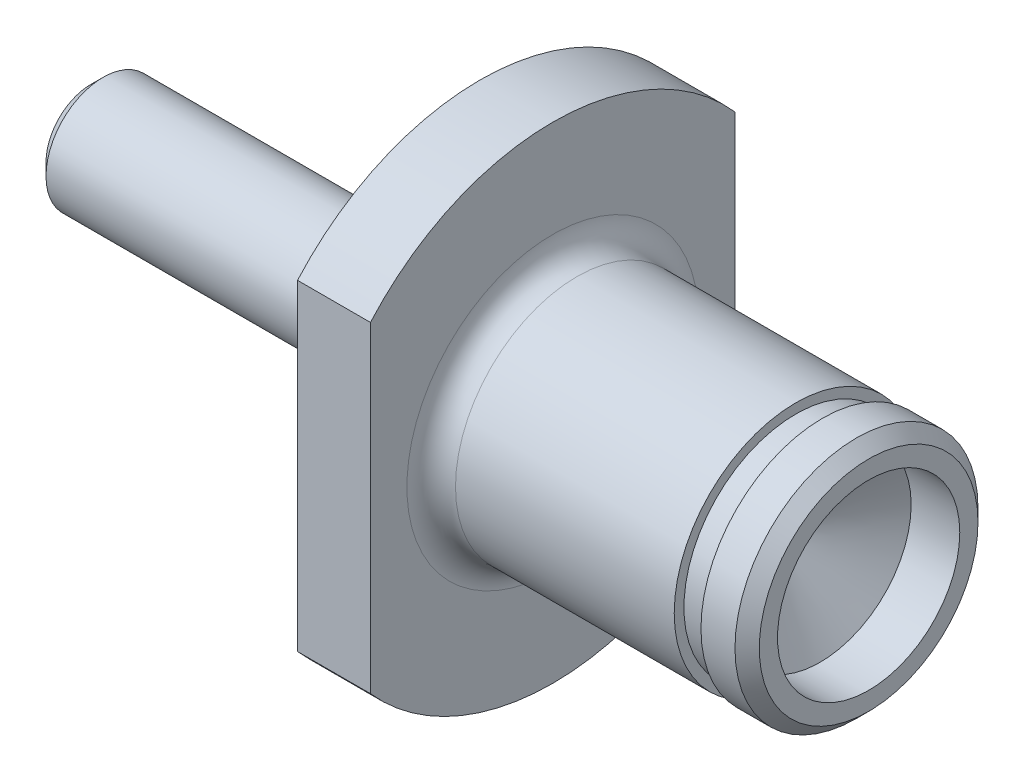
ISO-10303-21;
HEADER;
FILE_DESCRIPTION(('STEP AP214'),'2;1');
FILE_NAME('part.step','',(''),(''),'','','');
FILE_SCHEMA(('AUTOMOTIVE_DESIGN { 1 0 10303 214 1 1 1 1 }'));
ENDSEC;
DATA;
#1=APPLICATION_CONTEXT('core data for automotive mechanical design processes');
#2=APPLICATION_PROTOCOL_DEFINITION('international standard','automotive_design',2000,#1);
#3=PRODUCT_CONTEXT('',#1,'mechanical');
#4=PRODUCT('Part','Part','',(#3));
#5=PRODUCT_RELATED_PRODUCT_CATEGORY('part','',(#4));
#6=PRODUCT_DEFINITION_FORMATION('','',#4);
#7=PRODUCT_DEFINITION_CONTEXT('part definition',#1,'design');
#8=PRODUCT_DEFINITION('design','',#6,#7);
#9=PRODUCT_DEFINITION_SHAPE('','',#8);
#10=(LENGTH_UNIT() NAMED_UNIT(*) SI_UNIT(.MILLI.,.METRE.));
#11=(NAMED_UNIT(*) PLANE_ANGLE_UNIT() SI_UNIT($,.RADIAN.));
#12=(NAMED_UNIT(*) SI_UNIT($,.STERADIAN.) SOLID_ANGLE_UNIT());
#13=UNCERTAINTY_MEASURE_WITH_UNIT(LENGTH_MEASURE(1.E-05),#10,'distance_accuracy_value','');
#14=(GEOMETRIC_REPRESENTATION_CONTEXT(3) GLOBAL_UNCERTAINTY_ASSIGNED_CONTEXT((#13)) GLOBAL_UNIT_ASSIGNED_CONTEXT((#10,
#11,#12)) REPRESENTATION_CONTEXT('',''));
#15=CARTESIAN_POINT('',(0.,0.,0.));
#16=DIRECTION('',(0.,0.,1.));
#17=DIRECTION('',(1.,0.,0.));
#18=AXIS2_PLACEMENT_3D('',#15,#16,#17);
#19=CARTESIAN_POINT('',(16.,2.35,0.));
#20=DIRECTION('',(-1.,0.,0.));
#21=DIRECTION('',(0.,0.,1.));
#22=AXIS2_PLACEMENT_3D('',#19,#20,#21);
#23=PLANE('',#22);
#24=CARTESIAN_POINT('',(16.,0.,0.));
#25=DIRECTION('',(-1.,0.,0.));
#26=DIRECTION('',(0.,0.,1.));
#27=AXIS2_PLACEMENT_3D('',#24,#25,#26);
#28=CIRCLE('',#27,2.85);
#29=CARTESIAN_POINT('',(16.,0.,2.85));
#30=VERTEX_POINT('',#29);
#31=EDGE_CURVE('E206',#30,#30,#28,.F.);
#32=ORIENTED_EDGE('',*,*,#31,.T.);
#33=EDGE_LOOP('',(#32));
#34=FACE_BOUND('',#33,.T.);
#35=CARTESIAN_POINT('',(16.,0.,0.));
#36=DIRECTION('',(1.,0.,0.));
#37=DIRECTION('',(0.,0.,-1.));
#38=AXIS2_PLACEMENT_3D('',#35,#36,#37);
#39=CIRCLE('',#38,10.);
#40=CARTESIAN_POINT('',(16.,6.61437827766148,-7.5));
#41=VERTEX_POINT('',#40);
#42=CARTESIAN_POINT('',(16.,6.61437827766148,7.5));
#43=VERTEX_POINT('',#42);
#44=EDGE_CURVE('E182',#41,#43,#39,.T.);
#45=ORIENTED_EDGE('',*,*,#44,.F.);
#46=DIRECTION('',(0.,1.,0.));
#47=VECTOR('',#46,1.);
#48=CARTESIAN_POINT('',(16.,0.,-7.5));
#49=LINE('',#48,#47);
#50=CARTESIAN_POINT('',(16.,-6.61437827766148,-7.5));
#51=VERTEX_POINT('',#50);
#52=EDGE_CURVE('E167',#51,#41,#49,.T.);
#53=ORIENTED_EDGE('',*,*,#52,.F.);
#54=CARTESIAN_POINT('',(16.,-6.61437827766148,7.5));
#55=VERTEX_POINT('',#54);
#56=EDGE_CURVE('E191',#55,#51,#39,.T.);
#57=ORIENTED_EDGE('',*,*,#56,.F.);
#58=DIRECTION('',(0.,1.,0.));
#59=VECTOR('',#58,1.);
#60=CARTESIAN_POINT('',(16.,0.,7.5));
#61=LINE('',#60,#59);
#62=EDGE_CURVE('E188',#55,#43,#61,.T.);
#63=ORIENTED_EDGE('',*,*,#62,.T.);
#64=EDGE_LOOP('',(#45,#53,#57,#63));
#65=FACE_BOUND('',#64,.T.);
#66=ADVANCED_FACE('F123',(#34,#65),#23,.T.);
#67=CARTESIAN_POINT('',(0.,0.,0.));
#68=DIRECTION('',(1.,0.,0.));
#69=DIRECTION('',(0.,0.,-1.));
#70=AXIS2_PLACEMENT_3D('',#67,#68,#69);
#71=CYLINDRICAL_SURFACE('',#70,10.);
#72=CARTESIAN_POINT('',(19.,0.,0.));
#73=DIRECTION('',(1.,0.,0.));
#74=DIRECTION('',(0.,0.,-1.));
#75=AXIS2_PLACEMENT_3D('',#72,#73,#74);
#76=CIRCLE('',#75,10.);
#77=CARTESIAN_POINT('',(19.,6.61437827766148,-7.5));
#78=VERTEX_POINT('',#77);
#79=CARTESIAN_POINT('',(19.,6.61437827766148,7.5));
#80=VERTEX_POINT('',#79);
#81=EDGE_CURVE('E184',#78,#80,#76,.T.);
#82=ORIENTED_EDGE('',*,*,#81,.F.);
#83=DIRECTION('',(1.,0.,0.));
#84=VECTOR('',#83,1.);
#85=CARTESIAN_POINT('',(2.53708798216373,6.61437827766148,-7.5));
#86=LINE('',#85,#84);
#87=EDGE_CURVE('E148',#41,#78,#86,.T.);
#88=ORIENTED_EDGE('',*,*,#87,.F.);
#89=ORIENTED_EDGE('',*,*,#44,.T.);
#90=DIRECTION('',(1.,0.,0.));
#91=VECTOR('',#90,1.);
#92=CARTESIAN_POINT('',(2.53708798216373,6.61437827766148,7.5));
#93=LINE('',#92,#91);
#94=EDGE_CURVE('E353',#43,#80,#93,.T.);
#95=ORIENTED_EDGE('',*,*,#94,.T.);
#96=EDGE_LOOP('',(#82,#88,#89,#95));
#97=FACE_BOUND('',#96,.T.);
#98=ADVANCED_FACE('F180',(#97),#71,.T.);
#99=ORIENTED_EDGE('',*,*,#56,.T.);
#100=DIRECTION('',(1.,0.,0.));
#101=VECTOR('',#100,1.);
#102=CARTESIAN_POINT('',(2.53708798216373,-6.61437827766148,-7.5));
#103=LINE('',#102,#101);
#104=CARTESIAN_POINT('',(19.,-6.61437827766148,-7.5));
#105=VERTEX_POINT('',#104);
#106=EDGE_CURVE('E170',#51,#105,#103,.T.);
#107=ORIENTED_EDGE('',*,*,#106,.T.);
#108=CARTESIAN_POINT('',(19.,-6.61437827766148,7.5));
#109=VERTEX_POINT('',#108);
#110=EDGE_CURVE('E319',#109,#105,#76,.T.);
#111=ORIENTED_EDGE('',*,*,#110,.F.);
#112=DIRECTION('',(1.,0.,0.));
#113=VECTOR('',#112,1.);
#114=CARTESIAN_POINT('',(2.53708798216373,-6.61437827766148,7.5));
#115=LINE('',#114,#113);
#116=EDGE_CURVE('E140',#55,#109,#115,.T.);
#117=ORIENTED_EDGE('',*,*,#116,.F.);
#118=EDGE_LOOP('',(#99,#107,#111,#117));
#119=FACE_BOUND('',#118,.T.);
#120=ADVANCED_FACE('F246',(#119),#71,.T.);
#121=CARTESIAN_POINT('',(19.,10.,0.));
#122=DIRECTION('',(1.,0.,0.));
#123=DIRECTION('',(0.,0.,-1.));
#124=AXIS2_PLACEMENT_3D('',#121,#122,#123);
#125=PLANE('',#124);
#126=CARTESIAN_POINT('',(19.,0.,0.));
#127=DIRECTION('',(1.,0.,0.));
#128=DIRECTION('',(0.,0.,-1.));
#129=AXIS2_PLACEMENT_3D('',#126,#127,#128);
#130=CIRCLE('',#129,6.);
#131=CARTESIAN_POINT('',(19.,0.,-6.));
#132=VERTEX_POINT('',#131);
#133=EDGE_CURVE('E217',#132,#132,#130,.F.);
#134=ORIENTED_EDGE('',*,*,#133,.T.);
#135=EDGE_LOOP('',(#134));
#136=FACE_BOUND('',#135,.T.);
#137=ORIENTED_EDGE('',*,*,#110,.T.);
#138=DIRECTION('',(0.,1.,0.));
#139=VECTOR('',#138,1.);
#140=CARTESIAN_POINT('',(19.,0.,-7.5));
#141=LINE('',#140,#139);
#142=EDGE_CURVE('E320',#105,#78,#141,.T.);
#143=ORIENTED_EDGE('',*,*,#142,.T.);
#144=ORIENTED_EDGE('',*,*,#81,.T.);
#145=DIRECTION('',(0.,1.,0.));
#146=VECTOR('',#145,1.);
#147=CARTESIAN_POINT('',(19.,0.,7.5));
#148=LINE('',#147,#146);
#149=EDGE_CURVE('E321',#109,#80,#148,.T.);
#150=ORIENTED_EDGE('',*,*,#149,.F.);
#151=EDGE_LOOP('',(#137,#143,#144,#150));
#152=FACE_BOUND('',#151,.T.);
#153=ADVANCED_FACE('F258',(#136,#152),#125,.T.);
#154=CARTESIAN_POINT('',(0.,0.,0.));
#155=DIRECTION('',(-1.,0.,0.));
#156=DIRECTION('',(0.,0.,1.));
#157=AXIS2_PLACEMENT_3D('',#154,#155,#156);
#158=PLANE('',#157);
#159=CARTESIAN_POINT('',(0.,0.,0.));
#160=DIRECTION('',(-1.,0.,0.));
#161=DIRECTION('',(0.,0.,1.));
#162=AXIS2_PLACEMENT_3D('',#159,#160,#161);
#163=CIRCLE('',#162,1.85);
#164=CARTESIAN_POINT('',(0.,0.,1.85));
#165=VERTEX_POINT('',#164);
#166=EDGE_CURVE('E198',#165,#165,#163,.T.);
#167=ORIENTED_EDGE('',*,*,#166,.T.);
#168=EDGE_LOOP('',(#167));
#169=FACE_BOUND('',#168,.T.);
#170=ADVANCED_FACE('F254',(#169),#158,.T.);
#171=CARTESIAN_POINT('',(0.,0.,0.));
#172=DIRECTION('',(1.,0.,0.));
#173=DIRECTION('',(0.,0.,-1.));
#174=AXIS2_PLACEMENT_3D('',#171,#172,#173);
#175=CYLINDRICAL_SURFACE('',#174,2.35);
#176=CARTESIAN_POINT('',(15.5,0.,0.));
#177=DIRECTION('',(-1.,0.,0.));
#178=DIRECTION('',(0.,0.,1.));
#179=AXIS2_PLACEMENT_3D('',#176,#177,#178);
#180=CIRCLE('',#179,2.35);
#181=CARTESIAN_POINT('',(15.5,0.,2.35));
#182=VERTEX_POINT('',#181);
#183=EDGE_CURVE('E210',#182,#182,#180,.T.);
#184=ORIENTED_EDGE('',*,*,#183,.T.);
#185=EDGE_LOOP('',(#184));
#186=FACE_BOUND('',#185,.T.);
#187=CARTESIAN_POINT('',(0.499999999999997,0.,0.));
#188=DIRECTION('',(-1.,0.,0.));
#189=DIRECTION('',(0.,0.,1.));
#190=AXIS2_PLACEMENT_3D('',#187,#188,#189);
#191=CIRCLE('',#190,2.35);
#192=CARTESIAN_POINT('',(0.499999999999997,0.,2.35));
#193=VERTEX_POINT('',#192);
#194=EDGE_CURVE('E190',#193,#193,#191,.F.);
#195=ORIENTED_EDGE('',*,*,#194,.T.);
#196=EDGE_LOOP('',(#195));
#197=FACE_BOUND('',#196,.T.);
#198=ADVANCED_FACE('F250',(#186,#197),#175,.T.);
#199=CARTESIAN_POINT('',(0.,0.,0.));
#200=DIRECTION('',(1.,0.,0.));
#201=DIRECTION('',(0.,0.,-1.));
#202=AXIS2_PLACEMENT_3D('',#199,#200,#201);
#203=CYLINDRICAL_SURFACE('',#202,5.);
#204=CARTESIAN_POINT('',(20.,0.,0.));
#205=DIRECTION('',(1.,0.,0.));
#206=DIRECTION('',(0.,0.,-1.));
#207=AXIS2_PLACEMENT_3D('',#204,#205,#206);
#208=CIRCLE('',#207,5.);
#209=CARTESIAN_POINT('',(20.,0.,-5.));
#210=VERTEX_POINT('',#209);
#211=EDGE_CURVE('E214',#210,#210,#208,.T.);
#212=ORIENTED_EDGE('',*,*,#211,.T.);
#213=EDGE_LOOP('',(#212));
#214=FACE_BOUND('',#213,.T.);
#215=CARTESIAN_POINT('',(29.,0.,0.));
#216=DIRECTION('',(1.,0.,0.));
#217=DIRECTION('',(0.,0.,-1.));
#218=AXIS2_PLACEMENT_3D('',#215,#216,#217);
#219=CIRCLE('',#218,5.);
#220=CARTESIAN_POINT('',(29.,0.,-5.));
#221=VERTEX_POINT('',#220);
#222=EDGE_CURVE('E323',#221,#221,#219,.T.);
#223=ORIENTED_EDGE('',*,*,#222,.F.);
#224=EDGE_LOOP('',(#223));
#225=FACE_BOUND('',#224,.T.);
#226=ADVANCED_FACE('F253',(#214,#225),#203,.T.);
#227=CARTESIAN_POINT('',(29.,5.,0.));
#228=DIRECTION('',(1.,0.,0.));
#229=DIRECTION('',(0.,0.,-1.));
#230=AXIS2_PLACEMENT_3D('',#227,#228,#229);
#231=PLANE('',#230);
#232=ORIENTED_EDGE('',*,*,#222,.T.);
#233=EDGE_LOOP('',(#232));
#234=FACE_BOUND('',#233,.T.);
#235=CARTESIAN_POINT('',(29.,0.,0.));
#236=DIRECTION('',(1.,0.,0.));
#237=DIRECTION('',(0.,0.,-1.));
#238=AXIS2_PLACEMENT_3D('',#235,#236,#237);
#239=CIRCLE('',#238,4.6);
#240=CARTESIAN_POINT('',(29.,0.,-4.6));
#241=VERTEX_POINT('',#240);
#242=EDGE_CURVE('E328',#241,#241,#239,.T.);
#243=ORIENTED_EDGE('',*,*,#242,.F.);
#244=EDGE_LOOP('',(#243));
#245=FACE_BOUND('',#244,.T.);
#246=ADVANCED_FACE('F302',(#234,#245),#231,.T.);
#247=CARTESIAN_POINT('',(0.,0.,0.));
#248=DIRECTION('',(1.,0.,0.));
#249=DIRECTION('',(0.,0.,-1.));
#250=AXIS2_PLACEMENT_3D('',#247,#248,#249);
#251=CYLINDRICAL_SURFACE('',#250,4.6);
#252=ORIENTED_EDGE('',*,*,#242,.T.);
#253=EDGE_LOOP('',(#252));
#254=FACE_BOUND('',#253,.T.);
#255=CARTESIAN_POINT('',(30.1,0.,0.));
#256=DIRECTION('',(1.,0.,0.));
#257=DIRECTION('',(0.,0.,-1.));
#258=AXIS2_PLACEMENT_3D('',#255,#256,#257);
#259=CIRCLE('',#258,4.6);
#260=CARTESIAN_POINT('',(30.1,0.,-4.6));
#261=VERTEX_POINT('',#260);
#262=EDGE_CURVE('E333',#261,#261,#259,.T.);
#263=ORIENTED_EDGE('',*,*,#262,.F.);
#264=EDGE_LOOP('',(#263));
#265=FACE_BOUND('',#264,.T.);
#266=ADVANCED_FACE('F298',(#254,#265),#251,.T.);
#267=CARTESIAN_POINT('',(30.1,4.6,0.));
#268=DIRECTION('',(-1.,0.,0.));
#269=DIRECTION('',(0.,0.,1.));
#270=AXIS2_PLACEMENT_3D('',#267,#268,#269);
#271=PLANE('',#270);
#272=ORIENTED_EDGE('',*,*,#262,.T.);
#273=EDGE_LOOP('',(#272));
#274=FACE_BOUND('',#273,.T.);
#275=CARTESIAN_POINT('',(30.1,0.,0.));
#276=DIRECTION('',(1.,0.,0.));
#277=DIRECTION('',(0.,0.,-1.));
#278=AXIS2_PLACEMENT_3D('',#275,#276,#277);
#279=CIRCLE('',#278,5.);
#280=CARTESIAN_POINT('',(30.1,0.,-5.));
#281=VERTEX_POINT('',#280);
#282=EDGE_CURVE('E339',#281,#281,#279,.T.);
#283=ORIENTED_EDGE('',*,*,#282,.F.);
#284=EDGE_LOOP('',(#283));
#285=FACE_BOUND('',#284,.T.);
#286=ADVANCED_FACE('F294',(#274,#285),#271,.T.);
#287=CARTESIAN_POINT('',(0.,0.,0.));
#288=DIRECTION('',(1.,0.,0.));
#289=DIRECTION('',(0.,0.,-1.));
#290=AXIS2_PLACEMENT_3D('',#287,#288,#289);
#291=CYLINDRICAL_SURFACE('',#290,5.);
#292=CARTESIAN_POINT('',(31.5,0.,0.));
#293=DIRECTION('',(1.,0.,0.));
#294=DIRECTION('',(0.,0.,-1.));
#295=AXIS2_PLACEMENT_3D('',#292,#293,#294);
#296=CIRCLE('',#295,5.);
#297=CARTESIAN_POINT('',(31.5,0.,-5.));
#298=VERTEX_POINT('',#297);
#299=EDGE_CURVE('E14',#298,#298,#296,.F.);
#300=ORIENTED_EDGE('',*,*,#299,.T.);
#301=EDGE_LOOP('',(#300));
#302=FACE_BOUND('',#301,.T.);
#303=ORIENTED_EDGE('',*,*,#282,.T.);
#304=EDGE_LOOP('',(#303));
#305=FACE_BOUND('',#304,.T.);
#306=ADVANCED_FACE('F291',(#302,#305),#291,.T.);
#307=CARTESIAN_POINT('',(32.,5.,0.));
#308=DIRECTION('',(1.,0.,0.));
#309=DIRECTION('',(0.,0.,-1.));
#310=AXIS2_PLACEMENT_3D('',#307,#308,#309);
#311=PLANE('',#310);
#312=CARTESIAN_POINT('',(32.,0.,0.));
#313=DIRECTION('',(1.,0.,0.));
#314=DIRECTION('',(0.,0.,-1.));
#315=AXIS2_PLACEMENT_3D('',#312,#313,#314);
#316=CIRCLE('',#315,4.50000000000001);
#317=CARTESIAN_POINT('',(32.,0.,-4.50000000000001));
#318=VERTEX_POINT('',#317);
#319=EDGE_CURVE('E133',#318,#318,#316,.T.);
#320=ORIENTED_EDGE('',*,*,#319,.T.);
#321=EDGE_LOOP('',(#320));
#322=FACE_BOUND('',#321,.T.);
#323=CARTESIAN_POINT('',(32.,0.,0.));
#324=DIRECTION('',(1.,0.,0.));
#325=DIRECTION('',(0.,0.,-1.));
#326=AXIS2_PLACEMENT_3D('',#323,#324,#325);
#327=CIRCLE('',#326,3.75);
#328=CARTESIAN_POINT('',(32.,0.,-3.75));
#329=VERTEX_POINT('',#328);
#330=EDGE_CURVE('E347',#329,#329,#327,.T.);
#331=ORIENTED_EDGE('',*,*,#330,.F.);
#332=EDGE_LOOP('',(#331));
#333=FACE_BOUND('',#332,.T.);
#334=ADVANCED_FACE('F225',(#322,#333),#311,.T.);
#335=CARTESIAN_POINT('',(0.499999999999997,0.,0.));
#336=DIRECTION('',(1.,0.,0.));
#337=DIRECTION('',(0.,0.,-1.));
#338=AXIS2_PLACEMENT_3D('',#335,#336,#337);
#339=CONICAL_SURFACE('',#338,2.35,0.78539816339745);
#340=ORIENTED_EDGE('',*,*,#166,.F.);
#341=EDGE_LOOP('',(#340));
#342=FACE_BOUND('',#341,.T.);
#343=ORIENTED_EDGE('',*,*,#194,.F.);
#344=EDGE_LOOP('',(#343));
#345=FACE_BOUND('',#344,.T.);
#346=ADVANCED_FACE('F261',(#342,#345),#339,.T.);
#347=CARTESIAN_POINT('',(15.5,0.,0.));
#348=DIRECTION('',(-1.,0.,0.));
#349=DIRECTION('',(0.,0.,1.));
#350=AXIS2_PLACEMENT_3D('',#347,#348,#349);
#351=TOROIDAL_SURFACE('',#350,2.85,0.5);
#352=ORIENTED_EDGE('',*,*,#183,.F.);
#353=EDGE_LOOP('',(#352));
#354=FACE_BOUND('',#353,.T.);
#355=ORIENTED_EDGE('',*,*,#31,.F.);
#356=EDGE_LOOP('',(#355));
#357=FACE_BOUND('',#356,.T.);
#358=ADVANCED_FACE('F266',(#354,#357),#351,.F.);
#359=CARTESIAN_POINT('',(30.,0.,0.));
#360=DIRECTION('',(1.,0.,0.));
#361=DIRECTION('',(0.,0.,-1.));
#362=AXIS2_PLACEMENT_3D('',#359,#360,#361);
#363=CONICAL_SURFACE('',#362,3.75,1.02974425867665);
#364=CARTESIAN_POINT('',(27.7467726786466,0.,0.));
#365=VERTEX_POINT('',#364);
#366=VERTEX_LOOP('',#365);
#367=FACE_BOUND('',#366,.T.);
#368=CARTESIAN_POINT('',(30.,0.,0.));
#369=DIRECTION('',(1.,0.,0.));
#370=DIRECTION('',(0.,0.,-1.));
#371=AXIS2_PLACEMENT_3D('',#368,#369,#370);
#372=CIRCLE('',#371,3.75);
#373=CARTESIAN_POINT('',(30.,0.,-3.75));
#374=VERTEX_POINT('',#373);
#375=EDGE_CURVE('E343',#374,#374,#372,.T.);
#376=ORIENTED_EDGE('',*,*,#375,.T.);
#377=EDGE_LOOP('',(#376));
#378=FACE_BOUND('',#377,.T.);
#379=ADVANCED_FACE('F269',(#367,#378),#363,.F.);
#380=CARTESIAN_POINT('',(32.,0.,0.));
#381=DIRECTION('',(1.,0.,0.));
#382=DIRECTION('',(0.,0.,-1.));
#383=AXIS2_PLACEMENT_3D('',#380,#381,#382);
#384=CYLINDRICAL_SURFACE('',#383,3.75);
#385=ORIENTED_EDGE('',*,*,#375,.F.);
#386=EDGE_LOOP('',(#385));
#387=FACE_BOUND('',#386,.T.);
#388=ORIENTED_EDGE('',*,*,#330,.T.);
#389=EDGE_LOOP('',(#388));
#390=FACE_BOUND('',#389,.T.);
#391=ADVANCED_FACE('F237',(#387,#390),#384,.F.);
#392=CARTESIAN_POINT('',(20.,0.,0.));
#393=DIRECTION('',(1.,0.,0.));
#394=DIRECTION('',(0.,0.,-1.));
#395=AXIS2_PLACEMENT_3D('',#392,#393,#394);
#396=TOROIDAL_SURFACE('',#395,6.,1.);
#397=ORIENTED_EDGE('',*,*,#133,.F.);
#398=EDGE_LOOP('',(#397));
#399=FACE_BOUND('',#398,.T.);
#400=ORIENTED_EDGE('',*,*,#211,.F.);
#401=EDGE_LOOP('',(#400));
#402=FACE_BOUND('',#401,.T.);
#403=ADVANCED_FACE('F230',(#399,#402),#396,.F.);
#404=CARTESIAN_POINT('',(32.,0.,0.));
#405=DIRECTION('',(-1.,0.,0.));
#406=DIRECTION('',(0.,0.,1.));
#407=AXIS2_PLACEMENT_3D('',#404,#405,#406);
#408=CONICAL_SURFACE('',#407,4.50000000000001,0.785398163397448);
#409=ORIENTED_EDGE('',*,*,#299,.F.);
#410=EDGE_LOOP('',(#409));
#411=FACE_BOUND('',#410,.T.);
#412=ORIENTED_EDGE('',*,*,#319,.F.);
#413=EDGE_LOOP('',(#412));
#414=FACE_BOUND('',#413,.T.);
#415=ADVANCED_FACE('F126',(#411,#414),#408,.T.);
#416=CARTESIAN_POINT('',(2.53708798216373,0.,7.5));
#417=DIRECTION('',(0.,0.,-1.));
#418=DIRECTION('',(-1.,0.,0.));
#419=AXIS2_PLACEMENT_3D('',#416,#417,#418);
#420=PLANE('',#419);
#421=ORIENTED_EDGE('',*,*,#116,.T.);
#422=ORIENTED_EDGE('',*,*,#149,.T.);
#423=ORIENTED_EDGE('',*,*,#94,.F.);
#424=ORIENTED_EDGE('',*,*,#62,.F.);
#425=EDGE_LOOP('',(#421,#422,#423,#424));
#426=FACE_BOUND('',#425,.T.);
#427=ADVANCED_FACE('F229',(#426),#420,.F.);
#428=CARTESIAN_POINT('',(2.53708798216373,0.,-7.5));
#429=DIRECTION('',(0.,0.,-1.));
#430=DIRECTION('',(-1.,0.,0.));
#431=AXIS2_PLACEMENT_3D('',#428,#429,#430);
#432=PLANE('',#431);
#433=ORIENTED_EDGE('',*,*,#52,.T.);
#434=ORIENTED_EDGE('',*,*,#87,.T.);
#435=ORIENTED_EDGE('',*,*,#142,.F.);
#436=ORIENTED_EDGE('',*,*,#106,.F.);
#437=EDGE_LOOP('',(#433,#434,#435,#436));
#438=FACE_BOUND('',#437,.T.);
#439=ADVANCED_FACE('F168',(#438),#432,.T.);
#440=CLOSED_SHELL('',(#66,#98,#120,#153,#170,#198,#226,#246,#266,#286,#306,#334,#346,#358,#379,
#391,#403,#415,#427,#439));
#441=MANIFOLD_SOLID_BREP('B2',#440);
#442=ADVANCED_BREP_SHAPE_REPRESENTATION('',(#18,#441),#14);
#443=SHAPE_DEFINITION_REPRESENTATION(#9,#442);
ENDSEC;
END-ISO-10303-21;
